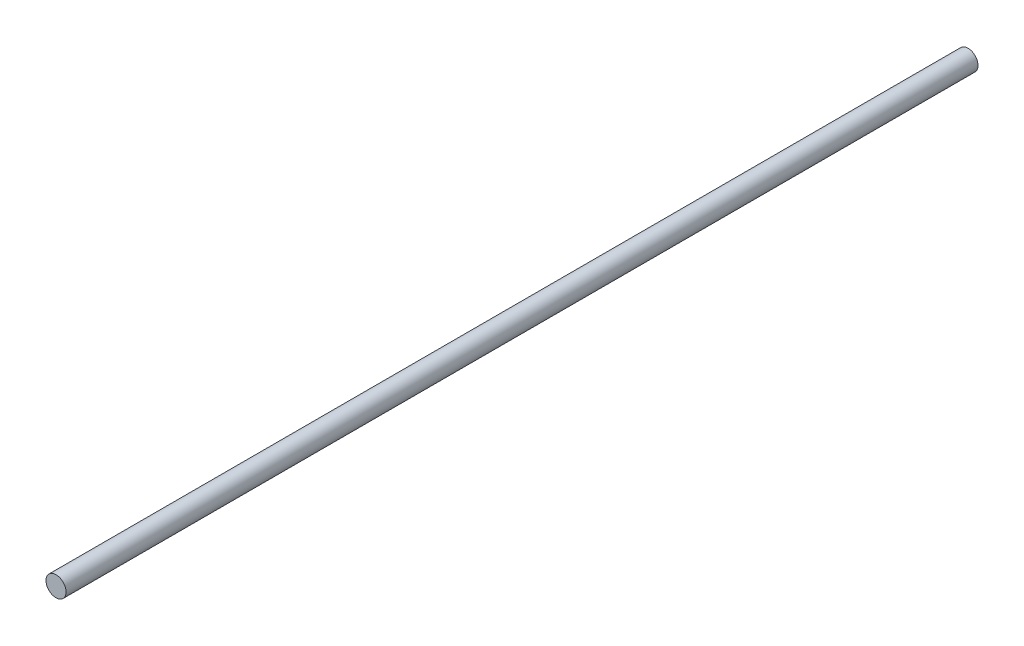
ISO-10303-21;
HEADER;
FILE_DESCRIPTION(('STEP AP214'),'2;1');
FILE_NAME('part.step','',(''),(''),'','','');
FILE_SCHEMA(('AUTOMOTIVE_DESIGN { 1 0 10303 214 1 1 1 1 }'));
ENDSEC;
DATA;
#1=APPLICATION_CONTEXT('core data for automotive mechanical design processes');
#2=APPLICATION_PROTOCOL_DEFINITION('international standard','automotive_design',2000,#1);
#3=PRODUCT_CONTEXT('',#1,'mechanical');
#4=PRODUCT('Part','Part','',(#3));
#5=PRODUCT_RELATED_PRODUCT_CATEGORY('part','',(#4));
#6=PRODUCT_DEFINITION_FORMATION('','',#4);
#7=PRODUCT_DEFINITION_CONTEXT('part definition',#1,'design');
#8=PRODUCT_DEFINITION('design','',#6,#7);
#9=PRODUCT_DEFINITION_SHAPE('','',#8);
#10=(LENGTH_UNIT() NAMED_UNIT(*) SI_UNIT(.MILLI.,.METRE.));
#11=(NAMED_UNIT(*) PLANE_ANGLE_UNIT() SI_UNIT($,.RADIAN.));
#12=(NAMED_UNIT(*) SI_UNIT($,.STERADIAN.) SOLID_ANGLE_UNIT());
#13=UNCERTAINTY_MEASURE_WITH_UNIT(LENGTH_MEASURE(1.E-05),#10,'distance_accuracy_value','');
#14=(GEOMETRIC_REPRESENTATION_CONTEXT(3) GLOBAL_UNCERTAINTY_ASSIGNED_CONTEXT((#13)) GLOBAL_UNIT_ASSIGNED_CONTEXT((#10,
#11,#12)) REPRESENTATION_CONTEXT('',''));
#15=CARTESIAN_POINT('',(0.,0.,0.));
#16=DIRECTION('',(0.,0.,1.));
#17=DIRECTION('',(1.,0.,0.));
#18=AXIS2_PLACEMENT_3D('',#15,#16,#17);
#19=CARTESIAN_POINT('',(0.,0.,144.4625));
#20=DIRECTION('',(0.,0.,-1.));
#21=DIRECTION('',(-1.,0.,0.));
#22=AXIS2_PLACEMENT_3D('',#19,#20,#21);
#23=CYLINDRICAL_SURFACE('',#22,1.5875);
#24=CARTESIAN_POINT('',(0.,0.,144.4625));
#25=DIRECTION('',(0.,0.,1.));
#26=DIRECTION('',(1.,0.,0.));
#27=AXIS2_PLACEMENT_3D('',#24,#25,#26);
#28=CIRCLE('',#27,1.5875);
#29=CARTESIAN_POINT('',(1.5875,0.,144.4625));
#30=VERTEX_POINT('',#29);
#31=EDGE_CURVE('E10',#30,#30,#28,.T.);
#32=ORIENTED_EDGE('',*,*,#31,.F.);
#33=EDGE_LOOP('',(#32));
#34=FACE_BOUND('',#33,.T.);
#35=CARTESIAN_POINT('',(0.,0.,0.));
#36=DIRECTION('',(0.,0.,1.));
#37=DIRECTION('',(1.,0.,0.));
#38=AXIS2_PLACEMENT_3D('',#35,#36,#37);
#39=CIRCLE('',#38,1.5875);
#40=CARTESIAN_POINT('',(1.5875,0.,0.));
#41=VERTEX_POINT('',#40);
#42=EDGE_CURVE('E33',#41,#41,#39,.T.);
#43=ORIENTED_EDGE('',*,*,#42,.T.);
#44=EDGE_LOOP('',(#43));
#45=FACE_BOUND('',#44,.T.);
#46=ADVANCED_FACE('F30',(#34,#45),#23,.T.);
#47=CARTESIAN_POINT('',(0.,0.,144.4625));
#48=DIRECTION('',(0.,0.,1.));
#49=DIRECTION('',(1.,0.,0.));
#50=AXIS2_PLACEMENT_3D('',#47,#48,#49);
#51=PLANE('',#50);
#52=ORIENTED_EDGE('',*,*,#31,.T.);
#53=EDGE_LOOP('',(#52));
#54=FACE_BOUND('',#53,.T.);
#55=ADVANCED_FACE('F45',(#54),#51,.T.);
#56=CARTESIAN_POINT('',(0.,0.,0.));
#57=DIRECTION('',(0.,0.,1.));
#58=DIRECTION('',(1.,0.,0.));
#59=AXIS2_PLACEMENT_3D('',#56,#57,#58);
#60=PLANE('',#59);
#61=ORIENTED_EDGE('',*,*,#42,.F.);
#62=EDGE_LOOP('',(#61));
#63=FACE_BOUND('',#62,.T.);
#64=ADVANCED_FACE('F43',(#63),#60,.F.);
#65=CLOSED_SHELL('',(#46,#55,#64));
#66=MANIFOLD_SOLID_BREP('B2',#65);
#67=ADVANCED_BREP_SHAPE_REPRESENTATION('',(#18,#66),#14);
#68=SHAPE_DEFINITION_REPRESENTATION(#9,#67);
ENDSEC;
END-ISO-10303-21;
